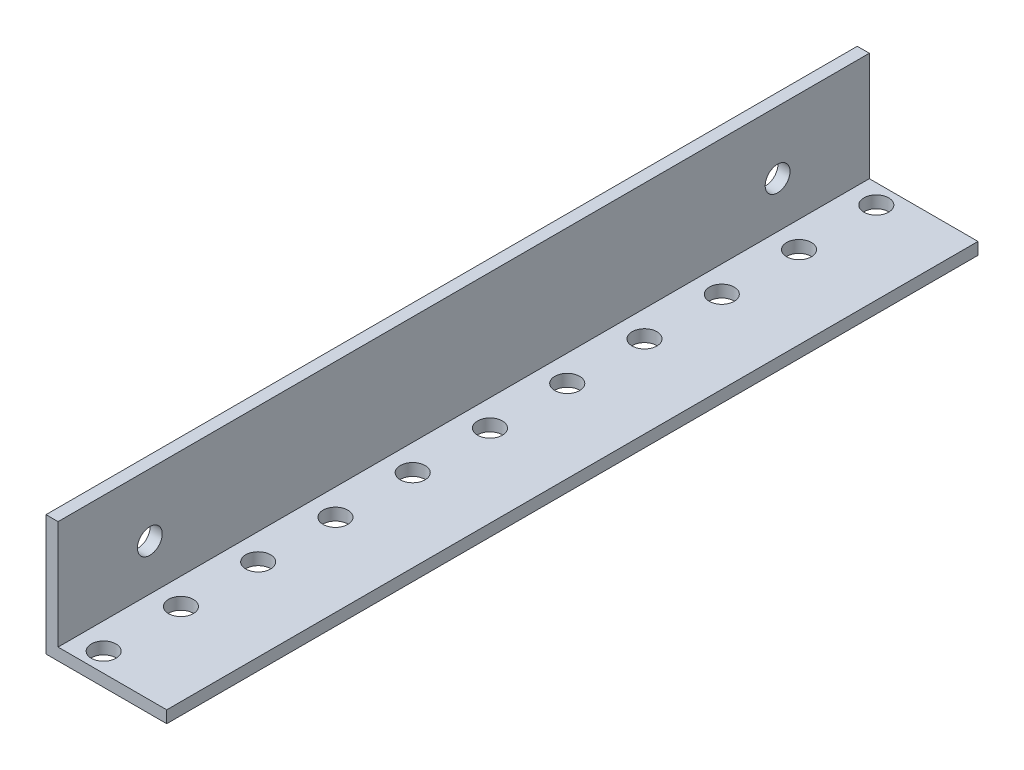
ISO-10303-21;
HEADER;
FILE_DESCRIPTION(('STEP AP214'),'2;1');
FILE_NAME('part.step','',(''),(''),'','','');
FILE_SCHEMA(('AUTOMOTIVE_DESIGN { 1 0 10303 214 1 1 1 1 }'));
ENDSEC;
DATA;
#1=APPLICATION_CONTEXT('core data for automotive mechanical design processes');
#2=APPLICATION_PROTOCOL_DEFINITION('international standard','automotive_design',2000,#1);
#3=PRODUCT_CONTEXT('',#1,'mechanical');
#4=PRODUCT('Part','Part','',(#3));
#5=PRODUCT_RELATED_PRODUCT_CATEGORY('part','',(#4));
#6=PRODUCT_DEFINITION_FORMATION('','',#4);
#7=PRODUCT_DEFINITION_CONTEXT('part definition',#1,'design');
#8=PRODUCT_DEFINITION('design','',#6,#7);
#9=PRODUCT_DEFINITION_SHAPE('','',#8);
#10=(LENGTH_UNIT() NAMED_UNIT(*) SI_UNIT(.MILLI.,.METRE.));
#11=(NAMED_UNIT(*) PLANE_ANGLE_UNIT() SI_UNIT($,.RADIAN.));
#12=(NAMED_UNIT(*) SI_UNIT($,.STERADIAN.) SOLID_ANGLE_UNIT());
#13=UNCERTAINTY_MEASURE_WITH_UNIT(LENGTH_MEASURE(1.E-05),#10,'distance_accuracy_value','');
#14=(GEOMETRIC_REPRESENTATION_CONTEXT(3) GLOBAL_UNCERTAINTY_ASSIGNED_CONTEXT((#13)) GLOBAL_UNIT_ASSIGNED_CONTEXT((#10,
#11,#12)) REPRESENTATION_CONTEXT('',''));
#15=CARTESIAN_POINT('',(0.,0.,0.));
#16=DIRECTION('',(0.,0.,1.));
#17=DIRECTION('',(1.,0.,0.));
#18=AXIS2_PLACEMENT_3D('',#15,#16,#17);
#19=CARTESIAN_POINT('',(1.5875,1.5875,53.34));
#20=DIRECTION('',(0.,-1.,0.));
#21=DIRECTION('',(1.,0.,0.));
#22=AXIS2_PLACEMENT_3D('',#19,#20,#21);
#23=PLANE('',#22);
#24=CARTESIAN_POINT('',(5.04189999999999,1.5875,50.8));
#25=DIRECTION('',(0.,1.,0.));
#26=DIRECTION('',(0.,0.,1.));
#27=AXIS2_PLACEMENT_3D('',#24,#25,#26);
#28=CIRCLE('',#27,1.63194999999999);
#29=CARTESIAN_POINT('',(5.04189999999999,1.5875,52.43195));
#30=VERTEX_POINT('',#29);
#31=EDGE_CURVE('E191',#30,#30,#28,.T.);
#32=ORIENTED_EDGE('',*,*,#31,.F.);
#33=EDGE_LOOP('',(#32));
#34=FACE_BOUND('',#33,.T.);
#35=CARTESIAN_POINT('',(5.04189999999999,1.5875,40.64));
#36=DIRECTION('',(0.,1.,0.));
#37=DIRECTION('',(0.,0.,1.));
#38=AXIS2_PLACEMENT_3D('',#35,#36,#37);
#39=CIRCLE('',#38,1.63194999999999);
#40=CARTESIAN_POINT('',(5.04189999999999,1.5875,42.27195));
#41=VERTEX_POINT('',#40);
#42=EDGE_CURVE('E201',#41,#41,#39,.T.);
#43=ORIENTED_EDGE('',*,*,#42,.F.);
#44=EDGE_LOOP('',(#43));
#45=FACE_BOUND('',#44,.T.);
#46=CARTESIAN_POINT('',(5.04189999999999,1.5875,30.48));
#47=DIRECTION('',(0.,1.,0.));
#48=DIRECTION('',(0.,0.,1.));
#49=AXIS2_PLACEMENT_3D('',#46,#47,#48);
#50=CIRCLE('',#49,1.63194999999999);
#51=CARTESIAN_POINT('',(5.04189999999999,1.5875,32.11195));
#52=VERTEX_POINT('',#51);
#53=EDGE_CURVE('E207',#52,#52,#50,.T.);
#54=ORIENTED_EDGE('',*,*,#53,.F.);
#55=EDGE_LOOP('',(#54));
#56=FACE_BOUND('',#55,.T.);
#57=CARTESIAN_POINT('',(5.04189999999999,1.5875,20.32));
#58=DIRECTION('',(0.,1.,0.));
#59=DIRECTION('',(0.,0.,1.));
#60=AXIS2_PLACEMENT_3D('',#57,#58,#59);
#61=CIRCLE('',#60,1.63194999999999);
#62=CARTESIAN_POINT('',(5.04189999999999,1.5875,21.95195));
#63=VERTEX_POINT('',#62);
#64=EDGE_CURVE('E213',#63,#63,#61,.T.);
#65=ORIENTED_EDGE('',*,*,#64,.F.);
#66=EDGE_LOOP('',(#65));
#67=FACE_BOUND('',#66,.T.);
#68=CARTESIAN_POINT('',(5.04189999999999,1.5875,10.16));
#69=DIRECTION('',(0.,1.,0.));
#70=DIRECTION('',(0.,0.,1.));
#71=AXIS2_PLACEMENT_3D('',#68,#69,#70);
#72=CIRCLE('',#71,1.63194999999999);
#73=CARTESIAN_POINT('',(5.04189999999999,1.5875,11.79195));
#74=VERTEX_POINT('',#73);
#75=EDGE_CURVE('E219',#74,#74,#72,.T.);
#76=ORIENTED_EDGE('',*,*,#75,.F.);
#77=EDGE_LOOP('',(#76));
#78=FACE_BOUND('',#77,.T.);
#79=CARTESIAN_POINT('',(5.04189999999999,1.5875,-50.8));
#80=DIRECTION('',(0.,1.,0.));
#81=DIRECTION('',(0.,0.,1.));
#82=AXIS2_PLACEMENT_3D('',#79,#80,#81);
#83=CIRCLE('',#82,1.63194999999999);
#84=CARTESIAN_POINT('',(5.04189999999999,1.5875,-49.16805));
#85=VERTEX_POINT('',#84);
#86=EDGE_CURVE('E225',#85,#85,#83,.T.);
#87=ORIENTED_EDGE('',*,*,#86,.F.);
#88=EDGE_LOOP('',(#87));
#89=FACE_BOUND('',#88,.T.);
#90=DIRECTION('',(-1.,0.,0.));
#91=VECTOR('',#90,1.);
#92=CARTESIAN_POINT('',(1.5875,1.5875,-53.34));
#93=LINE('',#92,#91);
#94=CARTESIAN_POINT('',(15.875,1.5875,-53.34));
#95=VERTEX_POINT('',#94);
#96=CARTESIAN_POINT('',(1.5875,1.5875,-53.34));
#97=VERTEX_POINT('',#96);
#98=EDGE_CURVE('E129',#95,#97,#93,.T.);
#99=ORIENTED_EDGE('',*,*,#98,.T.);
#100=DIRECTION('',(0.,0.,-1.));
#101=VECTOR('',#100,1.);
#102=CARTESIAN_POINT('',(1.5875,1.5875,53.34));
#103=LINE('',#102,#101);
#104=CARTESIAN_POINT('',(1.5875,1.5875,53.34));
#105=VERTEX_POINT('',#104);
#106=EDGE_CURVE('E114',#105,#97,#103,.T.);
#107=ORIENTED_EDGE('',*,*,#106,.F.);
#108=DIRECTION('',(-1.,0.,0.));
#109=VECTOR('',#108,1.);
#110=CARTESIAN_POINT('',(1.5875,1.5875,53.34));
#111=LINE('',#110,#109);
#112=CARTESIAN_POINT('',(15.875,1.5875,53.34));
#113=VERTEX_POINT('',#112);
#114=EDGE_CURVE('E105',#113,#105,#111,.T.);
#115=ORIENTED_EDGE('',*,*,#114,.F.);
#116=DIRECTION('',(0.,0.,-1.));
#117=VECTOR('',#116,1.);
#118=CARTESIAN_POINT('',(15.875,1.5875,53.34));
#119=LINE('',#118,#117);
#120=EDGE_CURVE('E47',#113,#95,#119,.T.);
#121=ORIENTED_EDGE('',*,*,#120,.T.);
#122=EDGE_LOOP('',(#99,#107,#115,#121));
#123=FACE_BOUND('',#122,.T.);
#124=CARTESIAN_POINT('',(5.04189999999999,1.5875,0.));
#125=DIRECTION('',(0.,1.,0.));
#126=DIRECTION('',(0.,0.,1.));
#127=AXIS2_PLACEMENT_3D('',#124,#125,#126);
#128=CIRCLE('',#127,1.63194999999999);
#129=CARTESIAN_POINT('',(5.04189999999999,1.5875,1.63194999999999));
#130=VERTEX_POINT('',#129);
#131=EDGE_CURVE('E252',#130,#130,#128,.T.);
#132=ORIENTED_EDGE('',*,*,#131,.F.);
#133=EDGE_LOOP('',(#132));
#134=FACE_BOUND('',#133,.T.);
#135=CARTESIAN_POINT('',(5.04189999999999,1.5875,-10.16));
#136=DIRECTION('',(0.,1.,0.));
#137=DIRECTION('',(0.,0.,1.));
#138=AXIS2_PLACEMENT_3D('',#135,#136,#137);
#139=CIRCLE('',#138,1.63194999999999);
#140=CARTESIAN_POINT('',(5.04189999999999,1.5875,-8.52805000000001));
#141=VERTEX_POINT('',#140);
#142=EDGE_CURVE('E246',#141,#141,#139,.T.);
#143=ORIENTED_EDGE('',*,*,#142,.F.);
#144=EDGE_LOOP('',(#143));
#145=FACE_BOUND('',#144,.T.);
#146=CARTESIAN_POINT('',(5.04189999999999,1.5875,-20.32));
#147=DIRECTION('',(0.,1.,0.));
#148=DIRECTION('',(0.,0.,1.));
#149=AXIS2_PLACEMENT_3D('',#146,#147,#148);
#150=CIRCLE('',#149,1.63194999999999);
#151=CARTESIAN_POINT('',(5.04189999999999,1.5875,-18.68805));
#152=VERTEX_POINT('',#151);
#153=EDGE_CURVE('E240',#152,#152,#150,.T.);
#154=ORIENTED_EDGE('',*,*,#153,.F.);
#155=EDGE_LOOP('',(#154));
#156=FACE_BOUND('',#155,.T.);
#157=CARTESIAN_POINT('',(5.04189999999999,1.5875,-30.48));
#158=DIRECTION('',(0.,1.,0.));
#159=DIRECTION('',(0.,0.,1.));
#160=AXIS2_PLACEMENT_3D('',#157,#158,#159);
#161=CIRCLE('',#160,1.63194999999999);
#162=CARTESIAN_POINT('',(5.04189999999999,1.5875,-28.84805));
#163=VERTEX_POINT('',#162);
#164=EDGE_CURVE('E234',#163,#163,#161,.T.);
#165=ORIENTED_EDGE('',*,*,#164,.F.);
#166=EDGE_LOOP('',(#165));
#167=FACE_BOUND('',#166,.T.);
#168=CARTESIAN_POINT('',(5.04189999999999,1.5875,-40.64));
#169=DIRECTION('',(0.,1.,0.));
#170=DIRECTION('',(0.,0.,1.));
#171=AXIS2_PLACEMENT_3D('',#168,#169,#170);
#172=CIRCLE('',#171,1.63194999999999);
#173=CARTESIAN_POINT('',(5.04189999999999,1.5875,-39.00805));
#174=VERTEX_POINT('',#173);
#175=EDGE_CURVE('E228',#174,#174,#172,.T.);
#176=ORIENTED_EDGE('',*,*,#175,.F.);
#177=EDGE_LOOP('',(#176));
#178=FACE_BOUND('',#177,.T.);
#179=ADVANCED_FACE('F37',(#34,#45,#56,#67,#78,#89,#123,#134,#145,#156,#167,#178),#23,.F.);
#180=CARTESIAN_POINT('',(15.875,0.,53.34));
#181=DIRECTION('',(0.,1.,0.));
#182=DIRECTION('',(-1.,0.,0.));
#183=AXIS2_PLACEMENT_3D('',#180,#181,#182);
#184=PLANE('',#183);
#185=CARTESIAN_POINT('',(5.04189999999999,0.,50.8));
#186=DIRECTION('',(0.,1.,0.));
#187=DIRECTION('',(-1.,0.,0.));
#188=AXIS2_PLACEMENT_3D('',#185,#186,#187);
#189=CIRCLE('',#188,1.63194999999999);
#190=CARTESIAN_POINT('',(3.40995,0.,50.8));
#191=VERTEX_POINT('',#190);
#192=EDGE_CURVE('E198',#191,#191,#189,.T.);
#193=ORIENTED_EDGE('',*,*,#192,.T.);
#194=EDGE_LOOP('',(#193));
#195=FACE_BOUND('',#194,.T.);
#196=CARTESIAN_POINT('',(5.04189999999999,0.,40.64));
#197=DIRECTION('',(0.,1.,0.));
#198=DIRECTION('',(-1.,0.,0.));
#199=AXIS2_PLACEMENT_3D('',#196,#197,#198);
#200=CIRCLE('',#199,1.63194999999999);
#201=CARTESIAN_POINT('',(3.40995,0.,40.64));
#202=VERTEX_POINT('',#201);
#203=EDGE_CURVE('E204',#202,#202,#200,.T.);
#204=ORIENTED_EDGE('',*,*,#203,.T.);
#205=EDGE_LOOP('',(#204));
#206=FACE_BOUND('',#205,.T.);
#207=CARTESIAN_POINT('',(5.04189999999999,0.,30.48));
#208=DIRECTION('',(0.,1.,0.));
#209=DIRECTION('',(-1.,0.,0.));
#210=AXIS2_PLACEMENT_3D('',#207,#208,#209);
#211=CIRCLE('',#210,1.63194999999999);
#212=CARTESIAN_POINT('',(3.40995,0.,30.48));
#213=VERTEX_POINT('',#212);
#214=EDGE_CURVE('E210',#213,#213,#211,.T.);
#215=ORIENTED_EDGE('',*,*,#214,.T.);
#216=EDGE_LOOP('',(#215));
#217=FACE_BOUND('',#216,.T.);
#218=CARTESIAN_POINT('',(5.04189999999999,0.,20.32));
#219=DIRECTION('',(0.,1.,0.));
#220=DIRECTION('',(-1.,0.,0.));
#221=AXIS2_PLACEMENT_3D('',#218,#219,#220);
#222=CIRCLE('',#221,1.63194999999999);
#223=CARTESIAN_POINT('',(3.40995,0.,20.32));
#224=VERTEX_POINT('',#223);
#225=EDGE_CURVE('E216',#224,#224,#222,.T.);
#226=ORIENTED_EDGE('',*,*,#225,.T.);
#227=EDGE_LOOP('',(#226));
#228=FACE_BOUND('',#227,.T.);
#229=CARTESIAN_POINT('',(5.04189999999999,0.,10.16));
#230=DIRECTION('',(0.,1.,0.));
#231=DIRECTION('',(-1.,0.,0.));
#232=AXIS2_PLACEMENT_3D('',#229,#230,#231);
#233=CIRCLE('',#232,1.63194999999999);
#234=CARTESIAN_POINT('',(3.40995,0.,10.16));
#235=VERTEX_POINT('',#234);
#236=EDGE_CURVE('E222',#235,#235,#233,.T.);
#237=ORIENTED_EDGE('',*,*,#236,.T.);
#238=EDGE_LOOP('',(#237));
#239=FACE_BOUND('',#238,.T.);
#240=CARTESIAN_POINT('',(5.04189999999999,0.,-50.8));
#241=DIRECTION('',(0.,1.,0.));
#242=DIRECTION('',(-1.,0.,0.));
#243=AXIS2_PLACEMENT_3D('',#240,#241,#242);
#244=CIRCLE('',#243,1.63194999999999);
#245=CARTESIAN_POINT('',(3.40995,0.,-50.8));
#246=VERTEX_POINT('',#245);
#247=EDGE_CURVE('E41',#246,#246,#244,.T.);
#248=ORIENTED_EDGE('',*,*,#247,.T.);
#249=EDGE_LOOP('',(#248));
#250=FACE_BOUND('',#249,.T.);
#251=CARTESIAN_POINT('',(5.04189999999999,0.,-40.64));
#252=DIRECTION('',(0.,1.,0.));
#253=DIRECTION('',(-1.,0.,0.));
#254=AXIS2_PLACEMENT_3D('',#251,#252,#253);
#255=CIRCLE('',#254,1.63194999999999);
#256=CARTESIAN_POINT('',(3.40995,0.,-40.64));
#257=VERTEX_POINT('',#256);
#258=EDGE_CURVE('E231',#257,#257,#255,.T.);
#259=ORIENTED_EDGE('',*,*,#258,.T.);
#260=EDGE_LOOP('',(#259));
#261=FACE_BOUND('',#260,.T.);
#262=CARTESIAN_POINT('',(5.04189999999999,0.,-30.48));
#263=DIRECTION('',(0.,1.,0.));
#264=DIRECTION('',(-1.,0.,0.));
#265=AXIS2_PLACEMENT_3D('',#262,#263,#264);
#266=CIRCLE('',#265,1.63194999999999);
#267=CARTESIAN_POINT('',(3.40995,0.,-30.48));
#268=VERTEX_POINT('',#267);
#269=EDGE_CURVE('E237',#268,#268,#266,.T.);
#270=ORIENTED_EDGE('',*,*,#269,.T.);
#271=EDGE_LOOP('',(#270));
#272=FACE_BOUND('',#271,.T.);
#273=CARTESIAN_POINT('',(5.04189999999999,0.,-20.32));
#274=DIRECTION('',(0.,1.,0.));
#275=DIRECTION('',(-1.,0.,0.));
#276=AXIS2_PLACEMENT_3D('',#273,#274,#275);
#277=CIRCLE('',#276,1.63194999999999);
#278=CARTESIAN_POINT('',(3.40995,0.,-20.32));
#279=VERTEX_POINT('',#278);
#280=EDGE_CURVE('E243',#279,#279,#277,.T.);
#281=ORIENTED_EDGE('',*,*,#280,.T.);
#282=EDGE_LOOP('',(#281));
#283=FACE_BOUND('',#282,.T.);
#284=CARTESIAN_POINT('',(5.04189999999999,0.,-10.16));
#285=DIRECTION('',(0.,1.,0.));
#286=DIRECTION('',(-1.,0.,0.));
#287=AXIS2_PLACEMENT_3D('',#284,#285,#286);
#288=CIRCLE('',#287,1.63194999999999);
#289=CARTESIAN_POINT('',(3.40995,0.,-10.16));
#290=VERTEX_POINT('',#289);
#291=EDGE_CURVE('E249',#290,#290,#288,.T.);
#292=ORIENTED_EDGE('',*,*,#291,.T.);
#293=EDGE_LOOP('',(#292));
#294=FACE_BOUND('',#293,.T.);
#295=CARTESIAN_POINT('',(5.04189999999999,0.,0.));
#296=DIRECTION('',(0.,1.,0.));
#297=DIRECTION('',(-1.,0.,0.));
#298=AXIS2_PLACEMENT_3D('',#295,#296,#297);
#299=CIRCLE('',#298,1.63194999999999);
#300=CARTESIAN_POINT('',(3.40995,0.,0.));
#301=VERTEX_POINT('',#300);
#302=EDGE_CURVE('E127',#301,#301,#299,.T.);
#303=ORIENTED_EDGE('',*,*,#302,.T.);
#304=EDGE_LOOP('',(#303));
#305=FACE_BOUND('',#304,.T.);
#306=DIRECTION('',(1.,0.,0.));
#307=VECTOR('',#306,1.);
#308=CARTESIAN_POINT('',(15.875,0.,-53.34));
#309=LINE('',#308,#307);
#310=CARTESIAN_POINT('',(0.,0.,-53.34));
#311=VERTEX_POINT('',#310);
#312=CARTESIAN_POINT('',(15.875,0.,-53.34));
#313=VERTEX_POINT('',#312);
#314=EDGE_CURVE('E123',#311,#313,#309,.T.);
#315=ORIENTED_EDGE('',*,*,#314,.T.);
#316=DIRECTION('',(0.,0.,-1.));
#317=VECTOR('',#316,1.);
#318=CARTESIAN_POINT('',(15.875,0.,53.34));
#319=LINE('',#318,#317);
#320=CARTESIAN_POINT('',(15.875,0.,53.34));
#321=VERTEX_POINT('',#320);
#322=EDGE_CURVE('E11',#321,#313,#319,.T.);
#323=ORIENTED_EDGE('',*,*,#322,.F.);
#324=DIRECTION('',(1.,0.,0.));
#325=VECTOR('',#324,1.);
#326=CARTESIAN_POINT('',(15.875,0.,53.34));
#327=LINE('',#326,#325);
#328=CARTESIAN_POINT('',(0.,0.,53.34));
#329=VERTEX_POINT('',#328);
#330=EDGE_CURVE('E134',#329,#321,#327,.T.);
#331=ORIENTED_EDGE('',*,*,#330,.F.);
#332=DIRECTION('',(0.,0.,-1.));
#333=VECTOR('',#332,1.);
#334=CARTESIAN_POINT('',(0.,0.,53.34));
#335=LINE('',#334,#333);
#336=EDGE_CURVE('E119',#329,#311,#335,.T.);
#337=ORIENTED_EDGE('',*,*,#336,.T.);
#338=EDGE_LOOP('',(#315,#323,#331,#337));
#339=FACE_BOUND('',#338,.T.);
#340=ADVANCED_FACE('F39',(#195,#206,#217,#228,#239,#250,#261,#272,#283,#294,#305,#339),#184,.F.);
#341=CARTESIAN_POINT('',(15.875,1.5875,53.34));
#342=DIRECTION('',(-1.,0.,0.));
#343=DIRECTION('',(0.,0.,1.));
#344=AXIS2_PLACEMENT_3D('',#341,#342,#343);
#345=PLANE('',#344);
#346=DIRECTION('',(0.,1.,0.));
#347=VECTOR('',#346,1.);
#348=CARTESIAN_POINT('',(15.875,1.5875,-53.34));
#349=LINE('',#348,#347);
#350=EDGE_CURVE('E126',#313,#95,#349,.T.);
#351=ORIENTED_EDGE('',*,*,#350,.T.);
#352=ORIENTED_EDGE('',*,*,#120,.F.);
#353=DIRECTION('',(0.,1.,0.));
#354=VECTOR('',#353,1.);
#355=CARTESIAN_POINT('',(15.875,1.5875,53.34));
#356=LINE('',#355,#354);
#357=EDGE_CURVE('E92',#321,#113,#356,.T.);
#358=ORIENTED_EDGE('',*,*,#357,.F.);
#359=ORIENTED_EDGE('',*,*,#322,.T.);
#360=EDGE_LOOP('',(#351,#352,#358,#359));
#361=FACE_BOUND('',#360,.T.);
#362=ADVANCED_FACE('F167',(#361),#345,.F.);
#363=CARTESIAN_POINT('',(1.5875,15.875,53.34));
#364=DIRECTION('',(-1.,0.,0.));
#365=DIRECTION('',(0.,-1.,0.));
#366=AXIS2_PLACEMENT_3D('',#363,#364,#365);
#367=PLANE('',#366);
#368=CARTESIAN_POINT('',(1.5875,7.64032000000001,-41.275));
#369=DIRECTION('',(1.,0.,0.));
#370=DIRECTION('',(0.,0.,-1.));
#371=AXIS2_PLACEMENT_3D('',#368,#369,#370);
#372=CIRCLE('',#371,1.63194999999999);
#373=CARTESIAN_POINT('',(1.5875,7.64032000000001,-42.90695));
#374=VERTEX_POINT('',#373);
#375=EDGE_CURVE('E182',#374,#374,#372,.T.);
#376=ORIENTED_EDGE('',*,*,#375,.F.);
#377=EDGE_LOOP('',(#376));
#378=FACE_BOUND('',#377,.T.);
#379=CARTESIAN_POINT('',(1.5875,7.64032,41.275));
#380=DIRECTION('',(1.,0.,0.));
#381=DIRECTION('',(0.,0.,-1.));
#382=AXIS2_PLACEMENT_3D('',#379,#380,#381);
#383=CIRCLE('',#382,1.63194999999999);
#384=CARTESIAN_POINT('',(1.5875,7.64032,39.64305));
#385=VERTEX_POINT('',#384);
#386=EDGE_CURVE('E185',#385,#385,#383,.T.);
#387=ORIENTED_EDGE('',*,*,#386,.F.);
#388=EDGE_LOOP('',(#387));
#389=FACE_BOUND('',#388,.T.);
#390=DIRECTION('',(0.,1.,0.));
#391=VECTOR('',#390,1.);
#392=CARTESIAN_POINT('',(1.5875,15.875,-53.34));
#393=LINE('',#392,#391);
#394=CARTESIAN_POINT('',(1.5875,15.875,-53.34));
#395=VERTEX_POINT('',#394);
#396=EDGE_CURVE('E113',#97,#395,#393,.T.);
#397=ORIENTED_EDGE('',*,*,#396,.T.);
#398=DIRECTION('',(0.,0.,-1.));
#399=VECTOR('',#398,1.);
#400=CARTESIAN_POINT('',(1.5875,15.875,53.34));
#401=LINE('',#400,#399);
#402=CARTESIAN_POINT('',(1.5875,15.875,53.34));
#403=VERTEX_POINT('',#402);
#404=EDGE_CURVE('E110',#403,#395,#401,.T.);
#405=ORIENTED_EDGE('',*,*,#404,.F.);
#406=DIRECTION('',(0.,1.,0.));
#407=VECTOR('',#406,1.);
#408=CARTESIAN_POINT('',(1.5875,15.875,53.34));
#409=LINE('',#408,#407);
#410=EDGE_CURVE('E99',#105,#403,#409,.T.);
#411=ORIENTED_EDGE('',*,*,#410,.F.);
#412=ORIENTED_EDGE('',*,*,#106,.T.);
#413=EDGE_LOOP('',(#397,#405,#411,#412));
#414=FACE_BOUND('',#413,.T.);
#415=ADVANCED_FACE('F111',(#378,#389,#414),#367,.F.);
#416=CARTESIAN_POINT('',(0.,15.875,53.34));
#417=DIRECTION('',(0.,-1.,0.));
#418=DIRECTION('',(0.,0.,-1.));
#419=AXIS2_PLACEMENT_3D('',#416,#417,#418);
#420=PLANE('',#419);
#421=DIRECTION('',(-1.,0.,0.));
#422=VECTOR('',#421,1.);
#423=CARTESIAN_POINT('',(0.,15.875,-53.34));
#424=LINE('',#423,#422);
#425=CARTESIAN_POINT('',(0.,15.875,-53.34));
#426=VERTEX_POINT('',#425);
#427=EDGE_CURVE('E78',#395,#426,#424,.T.);
#428=ORIENTED_EDGE('',*,*,#427,.T.);
#429=DIRECTION('',(0.,0.,-1.));
#430=VECTOR('',#429,1.);
#431=CARTESIAN_POINT('',(0.,15.875,53.34));
#432=LINE('',#431,#430);
#433=CARTESIAN_POINT('',(0.,15.875,53.34));
#434=VERTEX_POINT('',#433);
#435=EDGE_CURVE('E115',#434,#426,#432,.T.);
#436=ORIENTED_EDGE('',*,*,#435,.F.);
#437=DIRECTION('',(-1.,0.,0.));
#438=VECTOR('',#437,1.);
#439=CARTESIAN_POINT('',(0.,15.875,53.34));
#440=LINE('',#439,#438);
#441=EDGE_CURVE('E103',#403,#434,#440,.T.);
#442=ORIENTED_EDGE('',*,*,#441,.F.);
#443=ORIENTED_EDGE('',*,*,#404,.T.);
#444=EDGE_LOOP('',(#428,#436,#442,#443));
#445=FACE_BOUND('',#444,.T.);
#446=ADVANCED_FACE('F117',(#445),#420,.F.);
#447=CARTESIAN_POINT('',(0.,0.,53.34));
#448=DIRECTION('',(1.,0.,0.));
#449=DIRECTION('',(0.,0.,-1.));
#450=AXIS2_PLACEMENT_3D('',#447,#448,#449);
#451=PLANE('',#450);
#452=CARTESIAN_POINT('',(0.,7.64032000000001,-41.275));
#453=DIRECTION('',(1.,0.,0.));
#454=DIRECTION('',(0.,0.,-1.));
#455=AXIS2_PLACEMENT_3D('',#452,#453,#454);
#456=CIRCLE('',#455,1.63194999999999);
#457=CARTESIAN_POINT('',(0.,7.64032000000001,-42.90695));
#458=VERTEX_POINT('',#457);
#459=EDGE_CURVE('E188',#458,#458,#456,.T.);
#460=ORIENTED_EDGE('',*,*,#459,.T.);
#461=EDGE_LOOP('',(#460));
#462=FACE_BOUND('',#461,.T.);
#463=CARTESIAN_POINT('',(0.,7.64032,41.275));
#464=DIRECTION('',(1.,0.,0.));
#465=DIRECTION('',(0.,0.,-1.));
#466=AXIS2_PLACEMENT_3D('',#463,#464,#465);
#467=CIRCLE('',#466,1.63194999999999);
#468=CARTESIAN_POINT('',(0.,7.64032,39.64305));
#469=VERTEX_POINT('',#468);
#470=EDGE_CURVE('E187',#469,#469,#467,.T.);
#471=ORIENTED_EDGE('',*,*,#470,.T.);
#472=EDGE_LOOP('',(#471));
#473=FACE_BOUND('',#472,.T.);
#474=DIRECTION('',(0.,-1.,0.));
#475=VECTOR('',#474,1.);
#476=CARTESIAN_POINT('',(0.,0.,-53.34));
#477=LINE('',#476,#475);
#478=EDGE_CURVE('E84',#426,#311,#477,.T.);
#479=ORIENTED_EDGE('',*,*,#478,.T.);
#480=ORIENTED_EDGE('',*,*,#336,.F.);
#481=DIRECTION('',(0.,-1.,0.));
#482=VECTOR('',#481,1.);
#483=CARTESIAN_POINT('',(0.,0.,53.34));
#484=LINE('',#483,#482);
#485=EDGE_CURVE('E55',#434,#329,#484,.T.);
#486=ORIENTED_EDGE('',*,*,#485,.F.);
#487=ORIENTED_EDGE('',*,*,#435,.T.);
#488=EDGE_LOOP('',(#479,#480,#486,#487));
#489=FACE_BOUND('',#488,.T.);
#490=ADVANCED_FACE('F148',(#462,#473,#489),#451,.F.);
#491=CARTESIAN_POINT('',(0.,0.,53.34));
#492=DIRECTION('',(0.,0.,-1.));
#493=DIRECTION('',(-1.,0.,0.));
#494=AXIS2_PLACEMENT_3D('',#491,#492,#493);
#495=PLANE('',#494);
#496=ORIENTED_EDGE('',*,*,#330,.T.);
#497=ORIENTED_EDGE('',*,*,#357,.T.);
#498=ORIENTED_EDGE('',*,*,#114,.T.);
#499=ORIENTED_EDGE('',*,*,#410,.T.);
#500=ORIENTED_EDGE('',*,*,#441,.T.);
#501=ORIENTED_EDGE('',*,*,#485,.T.);
#502=EDGE_LOOP('',(#496,#497,#498,#499,#500,#501));
#503=FACE_BOUND('',#502,.T.);
#504=ADVANCED_FACE('F101',(#503),#495,.F.);
#505=CARTESIAN_POINT('',(0.,0.,-53.34));
#506=DIRECTION('',(0.,0.,-1.));
#507=DIRECTION('',(-1.,0.,0.));
#508=AXIS2_PLACEMENT_3D('',#505,#506,#507);
#509=PLANE('',#508);
#510=ORIENTED_EDGE('',*,*,#314,.F.);
#511=ORIENTED_EDGE('',*,*,#478,.F.);
#512=ORIENTED_EDGE('',*,*,#427,.F.);
#513=ORIENTED_EDGE('',*,*,#396,.F.);
#514=ORIENTED_EDGE('',*,*,#98,.F.);
#515=ORIENTED_EDGE('',*,*,#350,.F.);
#516=EDGE_LOOP('',(#510,#511,#512,#513,#514,#515));
#517=FACE_BOUND('',#516,.T.);
#518=ADVANCED_FACE('F144',(#517),#509,.T.);
#519=CARTESIAN_POINT('',(5.04189999999999,1.5875,0.));
#520=DIRECTION('',(0.,1.,0.));
#521=DIRECTION('',(0.,0.,1.));
#522=AXIS2_PLACEMENT_3D('',#519,#520,#521);
#523=CYLINDRICAL_SURFACE('',#522,1.63194999999999);
#524=ORIENTED_EDGE('',*,*,#131,.T.);
#525=EDGE_LOOP('',(#524));
#526=FACE_BOUND('',#525,.T.);
#527=ORIENTED_EDGE('',*,*,#302,.F.);
#528=EDGE_LOOP('',(#527));
#529=FACE_BOUND('',#528,.T.);
#530=ADVANCED_FACE('F261',(#526,#529),#523,.F.);
#531=CARTESIAN_POINT('',(5.04189999999999,1.5875,-10.16));
#532=DIRECTION('',(0.,1.,0.));
#533=DIRECTION('',(0.,0.,1.));
#534=AXIS2_PLACEMENT_3D('',#531,#532,#533);
#535=CYLINDRICAL_SURFACE('',#534,1.63194999999999);
#536=ORIENTED_EDGE('',*,*,#142,.T.);
#537=EDGE_LOOP('',(#536));
#538=FACE_BOUND('',#537,.T.);
#539=ORIENTED_EDGE('',*,*,#291,.F.);
#540=EDGE_LOOP('',(#539));
#541=FACE_BOUND('',#540,.T.);
#542=ADVANCED_FACE('F263',(#538,#541),#535,.F.);
#543=CARTESIAN_POINT('',(5.04189999999999,1.5875,-20.32));
#544=DIRECTION('',(0.,1.,0.));
#545=DIRECTION('',(0.,0.,1.));
#546=AXIS2_PLACEMENT_3D('',#543,#544,#545);
#547=CYLINDRICAL_SURFACE('',#546,1.63194999999999);
#548=ORIENTED_EDGE('',*,*,#153,.T.);
#549=EDGE_LOOP('',(#548));
#550=FACE_BOUND('',#549,.T.);
#551=ORIENTED_EDGE('',*,*,#280,.F.);
#552=EDGE_LOOP('',(#551));
#553=FACE_BOUND('',#552,.T.);
#554=ADVANCED_FACE('F270',(#550,#553),#547,.F.);
#555=CARTESIAN_POINT('',(5.04189999999999,1.5875,-30.48));
#556=DIRECTION('',(0.,1.,0.));
#557=DIRECTION('',(0.,0.,1.));
#558=AXIS2_PLACEMENT_3D('',#555,#556,#557);
#559=CYLINDRICAL_SURFACE('',#558,1.63194999999999);
#560=ORIENTED_EDGE('',*,*,#164,.T.);
#561=EDGE_LOOP('',(#560));
#562=FACE_BOUND('',#561,.T.);
#563=ORIENTED_EDGE('',*,*,#269,.F.);
#564=EDGE_LOOP('',(#563));
#565=FACE_BOUND('',#564,.T.);
#566=ADVANCED_FACE('F276',(#562,#565),#559,.F.);
#567=CARTESIAN_POINT('',(5.04189999999999,1.5875,-40.64));
#568=DIRECTION('',(0.,1.,0.));
#569=DIRECTION('',(0.,0.,1.));
#570=AXIS2_PLACEMENT_3D('',#567,#568,#569);
#571=CYLINDRICAL_SURFACE('',#570,1.63194999999999);
#572=ORIENTED_EDGE('',*,*,#175,.T.);
#573=EDGE_LOOP('',(#572));
#574=FACE_BOUND('',#573,.T.);
#575=ORIENTED_EDGE('',*,*,#258,.F.);
#576=EDGE_LOOP('',(#575));
#577=FACE_BOUND('',#576,.T.);
#578=ADVANCED_FACE('F280',(#574,#577),#571,.F.);
#579=CARTESIAN_POINT('',(5.04189999999999,1.5875,-50.8));
#580=DIRECTION('',(0.,1.,0.));
#581=DIRECTION('',(0.,0.,1.));
#582=AXIS2_PLACEMENT_3D('',#579,#580,#581);
#583=CYLINDRICAL_SURFACE('',#582,1.63194999999999);
#584=ORIENTED_EDGE('',*,*,#86,.T.);
#585=EDGE_LOOP('',(#584));
#586=FACE_BOUND('',#585,.T.);
#587=ORIENTED_EDGE('',*,*,#247,.F.);
#588=EDGE_LOOP('',(#587));
#589=FACE_BOUND('',#588,.T.);
#590=ADVANCED_FACE('F284',(#586,#589),#583,.F.);
#591=CARTESIAN_POINT('',(5.04189999999999,1.5875,10.16));
#592=DIRECTION('',(0.,1.,0.));
#593=DIRECTION('',(0.,0.,1.));
#594=AXIS2_PLACEMENT_3D('',#591,#592,#593);
#595=CYLINDRICAL_SURFACE('',#594,1.63194999999999);
#596=ORIENTED_EDGE('',*,*,#75,.T.);
#597=EDGE_LOOP('',(#596));
#598=FACE_BOUND('',#597,.T.);
#599=ORIENTED_EDGE('',*,*,#236,.F.);
#600=EDGE_LOOP('',(#599));
#601=FACE_BOUND('',#600,.T.);
#602=ADVANCED_FACE('F288',(#598,#601),#595,.F.);
#603=CARTESIAN_POINT('',(5.04189999999999,1.5875,20.32));
#604=DIRECTION('',(0.,1.,0.));
#605=DIRECTION('',(0.,0.,1.));
#606=AXIS2_PLACEMENT_3D('',#603,#604,#605);
#607=CYLINDRICAL_SURFACE('',#606,1.63194999999999);
#608=ORIENTED_EDGE('',*,*,#64,.T.);
#609=EDGE_LOOP('',(#608));
#610=FACE_BOUND('',#609,.T.);
#611=ORIENTED_EDGE('',*,*,#225,.F.);
#612=EDGE_LOOP('',(#611));
#613=FACE_BOUND('',#612,.T.);
#614=ADVANCED_FACE('F292',(#610,#613),#607,.F.);
#615=CARTESIAN_POINT('',(5.04189999999999,1.5875,30.48));
#616=DIRECTION('',(0.,1.,0.));
#617=DIRECTION('',(0.,0.,1.));
#618=AXIS2_PLACEMENT_3D('',#615,#616,#617);
#619=CYLINDRICAL_SURFACE('',#618,1.63194999999999);
#620=ORIENTED_EDGE('',*,*,#53,.T.);
#621=EDGE_LOOP('',(#620));
#622=FACE_BOUND('',#621,.T.);
#623=ORIENTED_EDGE('',*,*,#214,.F.);
#624=EDGE_LOOP('',(#623));
#625=FACE_BOUND('',#624,.T.);
#626=ADVANCED_FACE('F296',(#622,#625),#619,.F.);
#627=CARTESIAN_POINT('',(5.04189999999999,1.5875,40.64));
#628=DIRECTION('',(0.,1.,0.));
#629=DIRECTION('',(0.,0.,1.));
#630=AXIS2_PLACEMENT_3D('',#627,#628,#629);
#631=CYLINDRICAL_SURFACE('',#630,1.63194999999999);
#632=ORIENTED_EDGE('',*,*,#42,.T.);
#633=EDGE_LOOP('',(#632));
#634=FACE_BOUND('',#633,.T.);
#635=ORIENTED_EDGE('',*,*,#203,.F.);
#636=EDGE_LOOP('',(#635));
#637=FACE_BOUND('',#636,.T.);
#638=ADVANCED_FACE('F300',(#634,#637),#631,.F.);
#639=CARTESIAN_POINT('',(5.04189999999999,1.5875,50.8));
#640=DIRECTION('',(0.,1.,0.));
#641=DIRECTION('',(0.,0.,1.));
#642=AXIS2_PLACEMENT_3D('',#639,#640,#641);
#643=CYLINDRICAL_SURFACE('',#642,1.63194999999999);
#644=ORIENTED_EDGE('',*,*,#31,.T.);
#645=EDGE_LOOP('',(#644));
#646=FACE_BOUND('',#645,.T.);
#647=ORIENTED_EDGE('',*,*,#192,.F.);
#648=EDGE_LOOP('',(#647));
#649=FACE_BOUND('',#648,.T.);
#650=ADVANCED_FACE('F304',(#646,#649),#643,.F.);
#651=CARTESIAN_POINT('',(1.5875,7.64032,41.275));
#652=DIRECTION('',(1.,0.,0.));
#653=DIRECTION('',(0.,0.,-1.));
#654=AXIS2_PLACEMENT_3D('',#651,#652,#653);
#655=CYLINDRICAL_SURFACE('',#654,1.63194999999999);
#656=ORIENTED_EDGE('',*,*,#386,.T.);
#657=EDGE_LOOP('',(#656));
#658=FACE_BOUND('',#657,.T.);
#659=ORIENTED_EDGE('',*,*,#470,.F.);
#660=EDGE_LOOP('',(#659));
#661=FACE_BOUND('',#660,.T.);
#662=ADVANCED_FACE('F308',(#658,#661),#655,.F.);
#663=CARTESIAN_POINT('',(1.5875,7.64032000000001,-41.275));
#664=DIRECTION('',(1.,0.,0.));
#665=DIRECTION('',(0.,0.,-1.));
#666=AXIS2_PLACEMENT_3D('',#663,#664,#665);
#667=CYLINDRICAL_SURFACE('',#666,1.63194999999999);
#668=ORIENTED_EDGE('',*,*,#375,.T.);
#669=EDGE_LOOP('',(#668));
#670=FACE_BOUND('',#669,.T.);
#671=ORIENTED_EDGE('',*,*,#459,.F.);
#672=EDGE_LOOP('',(#671));
#673=FACE_BOUND('',#672,.T.);
#674=ADVANCED_FACE('F312',(#670,#673),#667,.F.);
#675=CLOSED_SHELL('',(#179,#340,#362,#415,#446,#490,#504,#518,#530,#542,#554,#566,#578,#590,
#602,#614,#626,#638,#650,#662,#674));
#676=MANIFOLD_SOLID_BREP('B2',#675);
#677=ADVANCED_BREP_SHAPE_REPRESENTATION('',(#18,#676),#14);
#678=SHAPE_DEFINITION_REPRESENTATION(#9,#677);
ENDSEC;
END-ISO-10303-21;
